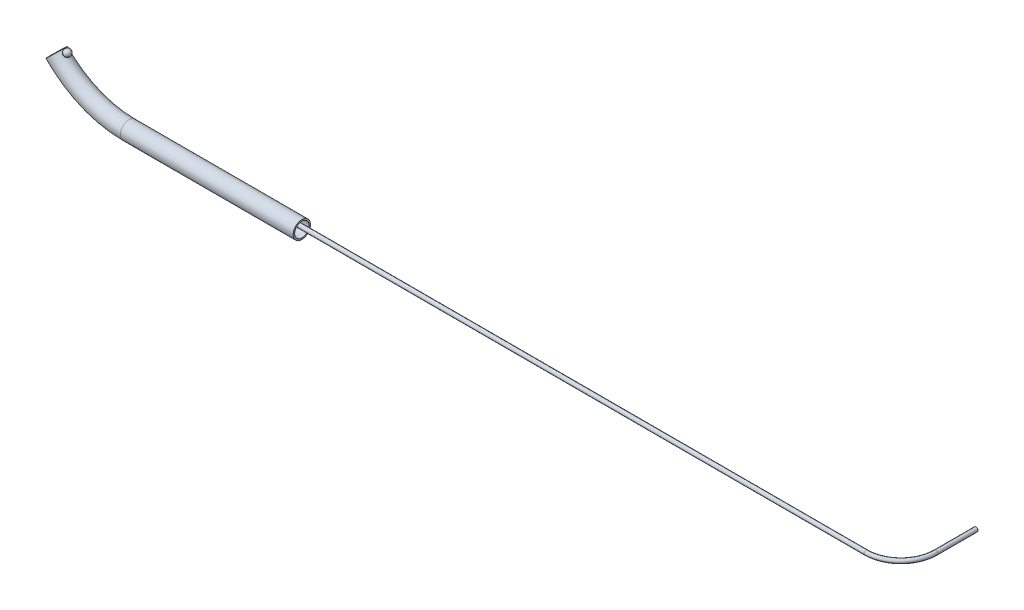
ISO-10303-21;
HEADER;
FILE_DESCRIPTION(('STEP AP214'),'2;1');
FILE_NAME('part.step','',(''),(''),'','','');
FILE_SCHEMA(('AUTOMOTIVE_DESIGN { 1 0 10303 214 1 1 1 1 }'));
ENDSEC;
DATA;
#1=APPLICATION_CONTEXT('core data for automotive mechanical design processes');
#2=APPLICATION_PROTOCOL_DEFINITION('international standard','automotive_design',2000,#1);
#3=PRODUCT_CONTEXT('',#1,'mechanical');
#4=PRODUCT('Part','Part','',(#3));
#5=PRODUCT_RELATED_PRODUCT_CATEGORY('part','',(#4));
#6=PRODUCT_DEFINITION_FORMATION('','',#4);
#7=PRODUCT_DEFINITION_CONTEXT('part definition',#1,'design');
#8=PRODUCT_DEFINITION('design','',#6,#7);
#9=PRODUCT_DEFINITION_SHAPE('','',#8);
#10=(LENGTH_UNIT() NAMED_UNIT(*) SI_UNIT(.MILLI.,.METRE.));
#11=(NAMED_UNIT(*) PLANE_ANGLE_UNIT() SI_UNIT($,.RADIAN.));
#12=(NAMED_UNIT(*) SI_UNIT($,.STERADIAN.) SOLID_ANGLE_UNIT());
#13=UNCERTAINTY_MEASURE_WITH_UNIT(LENGTH_MEASURE(1.E-05),#10,'distance_accuracy_value','');
#14=(GEOMETRIC_REPRESENTATION_CONTEXT(3) GLOBAL_UNCERTAINTY_ASSIGNED_CONTEXT((#13)) GLOBAL_UNIT_ASSIGNED_CONTEXT((#10,
#11,#12)) REPRESENTATION_CONTEXT('',''));
#15=CARTESIAN_POINT('',(0.,0.,0.));
#16=DIRECTION('',(0.,0.,1.));
#17=DIRECTION('',(1.,0.,0.));
#18=AXIS2_PLACEMENT_3D('',#15,#16,#17);
#19=CARTESIAN_POINT('',(-68.3649682129226,0.177699999999989,0.));
#20=DIRECTION('',(1.,0.,0.));
#21=DIRECTION('',(0.,1.,0.));
#22=AXIS2_PLACEMENT_3D('',#19,#20,#21);
#23=CYLINDRICAL_SURFACE('',#22,0.150000000000008);
#24=CARTESIAN_POINT('',(-68.3649682129226,0.177699999999989,0.));
#25=DIRECTION('',(-1.,0.,0.));
#26=DIRECTION('',(0.,-1.,0.));
#27=AXIS2_PLACEMENT_3D('',#24,#25,#26);
#28=CIRCLE('',#27,0.150000000000008);
#29=CARTESIAN_POINT('',(-68.3649682129226,0.0276999999999812,0.));
#30=VERTEX_POINT('',#29);
#31=EDGE_CURVE('E11',#30,#30,#28,.T.);
#32=ORIENTED_EDGE('',*,*,#31,.F.);
#33=EDGE_LOOP('',(#32));
#34=FACE_BOUND('',#33,.T.);
#35=CARTESIAN_POINT('',(-15.4542229508361,0.177700000000038,0.));
#36=DIRECTION('',(1.,0.,0.));
#37=DIRECTION('',(0.,1.,0.));
#38=AXIS2_PLACEMENT_3D('',#35,#36,#37);
#39=CIRCLE('',#38,0.150000000000008);
#40=CARTESIAN_POINT('',(-15.4542229508361,0.177700000000038,0.150000000000008));
#41=VERTEX_POINT('',#40);
#42=EDGE_CURVE('E58',#41,#41,#39,.T.);
#43=ORIENTED_EDGE('',*,*,#42,.F.);
#44=EDGE_LOOP('',(#43));
#45=FACE_BOUND('',#44,.T.);
#46=ADVANCED_FACE('F39',(#34,#45),#23,.T.);
#47=CARTESIAN_POINT('',(-68.3649682129226,7.15322745789866,0.));
#48=DIRECTION('',(0.,0.,-1.));
#49=DIRECTION('',(-1.,0.,0.));
#50=AXIS2_PLACEMENT_3D('',#47,#48,#49);
#51=TOROIDAL_SURFACE('',#50,6.97552745789867,0.150000000000008);
#52=CARTESIAN_POINT('',(-73.4211282675444,2.34768598810101,0.));
#53=DIRECTION('',(-0.688914422429251,0.724842685393853,0.));
#54=DIRECTION('',(-0.724842685393853,-0.688914422429251,0.));
#55=AXIS2_PLACEMENT_3D('',#52,#53,#54);
#56=CIRCLE('',#55,0.150000000000008);
#57=CARTESIAN_POINT('',(-73.5298546703535,2.24434882473662,0.));
#58=VERTEX_POINT('',#57);
#59=EDGE_CURVE('E45',#58,#58,#56,.T.);
#60=CARTESIAN_POINT('',(-68.3649682129226,7.15322745789866,0.));
#61=DIRECTION('',(0.,0.,-1.));
#62=DIRECTION('',(-1.,0.,0.));
#63=AXIS2_PLACEMENT_3D('',#60,#61,#62);
#64=CIRCLE('',#63,7.12552745789868);
#65=EDGE_CURVE('',#30,#58,#64,.T.);
#66=ORIENTED_EDGE('',*,*,#31,.T.);
#67=ORIENTED_EDGE('',*,*,#59,.F.);
#68=ORIENTED_EDGE('',*,*,#65,.T.);
#69=ORIENTED_EDGE('',*,*,#65,.F.);
#70=EDGE_LOOP('',(#66,#68,#67,#69));
#71=FACE_BOUND('',#70,.T.);
#72=ADVANCED_FACE('F66',(#71),#51,.T.);
#73=CARTESIAN_POINT('',(-73.4211282675444,2.34768598810101,0.));
#74=DIRECTION('',(-0.688914422429251,0.724842685393853,0.));
#75=DIRECTION('',(-0.724842685393853,-0.688914422429251,0.));
#76=AXIS2_PLACEMENT_3D('',#73,#74,#75);
#77=PLANE('',#76);
#78=ORIENTED_EDGE('',*,*,#59,.T.);
#79=EDGE_LOOP('',(#78));
#80=FACE_BOUND('',#79,.T.);
#81=ADVANCED_FACE('F71',(#80),#77,.T.);
#82=CARTESIAN_POINT('',(-12.9542229508361,0.177700000000041,-2.50000000000001));
#83=DIRECTION('',(0.,0.,-1.));
#84=DIRECTION('',(-1.,0.,0.));
#85=AXIS2_PLACEMENT_3D('',#82,#83,#84);
#86=CYLINDRICAL_SURFACE('',#85,0.150000000000008);
#87=CARTESIAN_POINT('',(-12.9542229508361,0.177700000000041,-2.50000000000001));
#88=DIRECTION('',(0.,0.,-1.));
#89=DIRECTION('',(0.,1.,0.));
#90=AXIS2_PLACEMENT_3D('',#87,#88,#89);
#91=CIRCLE('',#90,0.150000000000008);
#92=CARTESIAN_POINT('',(-12.8042229508361,0.177700000000041,-2.50000000000001));
#93=VERTEX_POINT('',#92);
#94=EDGE_CURVE('E53',#93,#93,#91,.T.);
#95=ORIENTED_EDGE('',*,*,#94,.T.);
#96=EDGE_LOOP('',(#95));
#97=FACE_BOUND('',#96,.T.);
#98=CARTESIAN_POINT('',(-12.9542229508361,0.177700000000041,-5.38145147143735));
#99=DIRECTION('',(0.,0.,-1.));
#100=DIRECTION('',(0.,1.,0.));
#101=AXIS2_PLACEMENT_3D('',#98,#99,#100);
#102=CIRCLE('',#101,0.150000000000008);
#103=CARTESIAN_POINT('',(-12.9542229508361,0.327700000000049,-5.38145147143735));
#104=VERTEX_POINT('',#103);
#105=EDGE_CURVE('E49',#104,#104,#102,.T.);
#106=ORIENTED_EDGE('',*,*,#105,.F.);
#107=EDGE_LOOP('',(#106));
#108=FACE_BOUND('',#107,.T.);
#109=ADVANCED_FACE('F75',(#97,#108),#86,.T.);
#110=CARTESIAN_POINT('',(-15.4542229508361,0.177700000000038,-2.5));
#111=DIRECTION('',(0.,1.,0.));
#112=DIRECTION('',(-1.,0.,0.));
#113=AXIS2_PLACEMENT_3D('',#110,#111,#112);
#114=TOROIDAL_SURFACE('',#113,2.5,0.150000000000008);
#115=CARTESIAN_POINT('',(-15.4542229508361,0.177700000000038,-2.5));
#116=DIRECTION('',(0.,1.,0.));
#117=DIRECTION('',(-1.,0.,0.));
#118=AXIS2_PLACEMENT_3D('',#115,#116,#117);
#119=CIRCLE('',#118,2.65000000000001);
#120=EDGE_CURVE('',#41,#93,#119,.T.);
#121=ORIENTED_EDGE('',*,*,#42,.T.);
#122=ORIENTED_EDGE('',*,*,#94,.F.);
#123=ORIENTED_EDGE('',*,*,#120,.T.);
#124=ORIENTED_EDGE('',*,*,#120,.F.);
#125=EDGE_LOOP('',(#121,#123,#122,#124));
#126=FACE_BOUND('',#125,.T.);
#127=ADVANCED_FACE('F62',(#126),#114,.T.);
#128=CARTESIAN_POINT('',(-12.9542229508361,0.177700000000041,-5.38145147143735));
#129=DIRECTION('',(0.,0.,-1.));
#130=DIRECTION('',(0.,1.,0.));
#131=AXIS2_PLACEMENT_3D('',#128,#129,#130);
#132=PLANE('',#131);
#133=ORIENTED_EDGE('',*,*,#105,.T.);
#134=EDGE_LOOP('',(#133));
#135=FACE_BOUND('',#134,.T.);
#136=ADVANCED_FACE('F84',(#135),#132,.T.);
#137=CLOSED_SHELL('',(#46,#72,#81,#109,#127,#136));
#138=MANIFOLD_SOLID_BREP('B2',#137);
#139=CARTESIAN_POINT('',(-68.3649682129226,7.15322745789866,0.));
#140=DIRECTION('',(0.,0.,-1.));
#141=DIRECTION('',(-1.,0.,0.));
#142=AXIS2_PLACEMENT_3D('',#139,#140,#141);
#143=TOROIDAL_SURFACE('',#142,7.15322745789866,0.6223);
#144=CARTESIAN_POINT('',(-72.9296125399738,2.45231556693282,-0.162231624588265));
#145=CARTESIAN_POINT('',(-72.9215501748899,2.44420333768813,-0.162985915621017));
#146=CARTESIAN_POINT('',(-72.9132495705184,2.43623847207314,-0.162846709843409));
#147=CARTESIAN_POINT('',(-72.8963949861295,2.42081537807001,-0.160778709201735));
#148=CARTESIAN_POINT('',(-72.8878408277221,2.41335751915316,-0.158848623959505));
#149=CARTESIAN_POINT('',(-72.8707373660263,2.39911414014025,-0.153191778621824));
#150=CARTESIAN_POINT('',(-72.8621880917451,2.39232970055476,-0.149462185634209));
#151=CARTESIAN_POINT('',(-72.8454360430442,2.37959646254954,-0.140212048773996));
#152=CARTESIAN_POINT('',(-72.8372332315845,2.37364757464263,-0.134691696900749));
#153=CARTESIAN_POINT('',(-72.8218060884418,2.36288393777016,-0.122093918042157));
#154=CARTESIAN_POINT('',(-72.8145597209712,2.35804041634906,-0.115068420488231));
#155=CARTESIAN_POINT('',(-72.8011924504897,2.34938409272325,-0.0994744633301903));
#156=CARTESIAN_POINT('',(-72.7950704932524,2.34557032344803,-0.0909074640869792));
#157=CARTESIAN_POINT('',(-72.7850736501799,2.33948792826428,-0.0736061865020022));
#158=CARTESIAN_POINT('',(-72.781013716827,2.33708589881384,-0.0650260965331795));
#159=CARTESIAN_POINT('',(-72.7743973684886,2.33322303008166,-0.0471086922633796));
#160=CARTESIAN_POINT('',(-72.7718391225746,2.33176104444553,-0.0377723159424036));
#161=CARTESIAN_POINT('',(-72.7686653842543,2.32995580921218,-0.0199973692769874));
#162=CARTESIAN_POINT('',(-72.7678327334275,2.32948730131519,-0.011609727470488));
#163=CARTESIAN_POINT('',(-72.7674973160465,2.32929803884335,0.00519934363481592));
#164=CARTESIAN_POINT('',(-72.7679940046332,2.32957697791094,0.0136207576785419));
#165=CARTESIAN_POINT('',(-72.7702102738688,2.33083351394292,0.0297025399185543));
#166=CARTESIAN_POINT('',(-72.7718512653795,2.33176623062762,0.0373775275720592));
#167=CARTESIAN_POINT('',(-72.7761766208485,2.3342596299772,0.0523186782891281));
#168=CARTESIAN_POINT('',(-72.7788610594966,2.33582035759531,0.0595848120443553));
#169=CARTESIAN_POINT('',(-72.7852512080412,2.33960631113679,0.0738019379896634));
#170=CARTESIAN_POINT('',(-72.7889905542734,2.34185366946152,0.0807318124321275));
#171=CARTESIAN_POINT('',(-72.7972669139487,2.34694798104276,0.0938534271152317));
#172=CARTESIAN_POINT('',(-72.8018042151244,2.34979515065723,0.100044899741415));
#173=CARTESIAN_POINT('',(-72.8120123433624,2.35637787321964,0.112221774400418));
#174=CARTESIAN_POINT('',(-72.8177523902374,2.36017568266087,0.118115344466518));
#175=CARTESIAN_POINT('',(-72.8297598410948,2.36839028741973,0.128835206562353));
#176=CARTESIAN_POINT('',(-72.8360274999649,2.37280738260601,0.133660978610083));
#177=CARTESIAN_POINT('',(-72.8497219337649,2.38280836253562,0.142770664884137));
#178=CARTESIAN_POINT('',(-72.8571935263533,2.38846927876268,0.146902796180538));
#179=CARTESIAN_POINT('',(-72.8722952549711,2.40040312787,0.153749912437162));
#180=CARTESIAN_POINT('',(-72.8799254653304,2.40667635301531,0.15646421668056));
#181=CARTESIAN_POINT('',(-72.8959291893155,2.42041080660626,0.160682718197196));
#182=CARTESIAN_POINT('',(-72.904296668265,2.42792761933674,0.162030015164965));
#183=CARTESIAN_POINT('',(-72.9207220427379,2.44340003977206,0.162990307676196));
#184=CARTESIAN_POINT('',(-72.9287798287983,2.45135580024961,0.162602695587667));
#185=CARTESIAN_POINT('',(-72.9447498127938,2.46787340554959,0.160032545070037));
#186=CARTESIAN_POINT('',(-72.952637563331,2.47644619234303,0.157766881614251));
#187=CARTESIAN_POINT('',(-72.9676574964394,2.49354628269152,0.151331048323228));
#188=CARTESIAN_POINT('',(-72.9747895849688,2.50207358046036,0.147160641785323));
#189=CARTESIAN_POINT('',(-72.9879595528189,2.51850933164872,0.137056287312086));
#190=CARTESIAN_POINT('',(-72.9940202797939,2.5264279135323,0.131168900787446));
#191=CARTESIAN_POINT('',(-73.0051104088774,2.54146259807317,0.117646424643872));
#192=CARTESIAN_POINT('',(-73.0101404599229,2.54857920439425,0.110012441171333));
#193=CARTESIAN_POINT('',(-73.0185749559031,2.56087620567489,0.0939956681869445));
#194=CARTESIAN_POINT('',(-73.0220926435068,2.56617986143605,0.0857677752173634));
#195=CARTESIAN_POINT('',(-73.0280775781637,2.57538568676014,0.0682183020941197));
#196=CARTESIAN_POINT('',(-73.0305462382761,2.57928974049664,0.0588982148881641));
#197=CARTESIAN_POINT('',(-73.0340767537525,2.58493685065564,0.0408849101830477));
#198=CARTESIAN_POINT('',(-73.0352893555977,2.58690917771996,0.0322927969828676));
#199=CARTESIAN_POINT('',(-73.03684537088,2.58944738088496,0.0148277251516942));
#200=CARTESIAN_POINT('',(-73.0371894040806,2.5900142598322,0.00595497135065177));
#201=CARTESIAN_POINT('',(-73.0370079156127,2.58971678700277,-0.0108743191841573));
#202=CARTESIAN_POINT('',(-73.0365650701557,2.58898850879263,-0.0188346392271665));
#203=CARTESIAN_POINT('',(-73.0349783886321,2.586404234979,-0.0344965034716511));
#204=CARTESIAN_POINT('',(-73.0338346091183,2.58454833035469,-0.0421980684971065));
#205=CARTESIAN_POINT('',(-73.030875745764,2.5798180665763,-0.057134396606846));
#206=CARTESIAN_POINT('',(-73.0290612748371,2.57694463739067,-0.0643695788290028));
#207=CARTESIAN_POINT('',(-73.024800243945,2.57032654058017,-0.0782271610208334));
#208=CARTESIAN_POINT('',(-73.0223535271467,2.56658165680752,-0.0848494083931327));
#209=CARTESIAN_POINT('',(-73.0166424786211,2.55804123795011,-0.0978968045459019));
#210=CARTESIAN_POINT('',(-73.0133267953118,2.55318393847707,-0.10425887638866));
#211=CARTESIAN_POINT('',(-73.0060644690918,2.54284792182489,-0.116048600807803));
#212=CARTESIAN_POINT('',(-73.0021174795615,2.5373688637512,-0.121475736636416));
#213=CARTESIAN_POINT('',(-72.9931158802613,2.52526180564205,-0.13197261554992));
#214=CARTESIAN_POINT('',(-72.9879842877483,2.51857620694077,-0.136909828851794));
#215=CARTESIAN_POINT('',(-72.9770866273557,2.50491070439849,-0.145502938981017));
#216=CARTESIAN_POINT('',(-72.9713205301259,2.49793078695248,-0.149158776503325));
#217=CARTESIAN_POINT('',(-72.9597410586429,2.48445892215581,-0.154934806732401));
#218=CARTESIAN_POINT('',(-72.9539698605184,2.4779735828661,-0.157155893578039));
#219=CARTESIAN_POINT('',(-72.942051704856,2.46506742440212,-0.160510070361542));
#220=CARTESIAN_POINT('',(-72.9359046752808,2.4586466178735,-0.161642951017979));
#221=CARTESIAN_POINT('',(-72.9296125399738,2.45231556693282,-0.162231624588265));
#222=B_SPLINE_CURVE_WITH_KNOTS('',3,(#144,#145,#146,#147,#148,#149,#150,#151,#152,#153,#154,
#155,#156,#157,#158,#159,#160,#161,#162,#163,#164,#165,#166,#167,#168,#169,#170,#171,#172,#173,
#174,#175,#176,#177,#178,#179,#180,#181,#182,#183,#184,#185,#186,#187,#188,#189,#190,#191,#192,
#193,#194,#195,#196,#197,#198,#199,#200,#201,#202,#203,#204,#205,#206,#207,#208,#209,#210,#211,
#212,#213,#214,#215,#216,#217,#218,#219,#220,#221),.UNSPECIFIED.,.T.,.F.,(4,2,2,2,2,2,2,2,2,2,2,
2,2,2,2,2,2,2,2,2,2,2,2,2,2,2,2,2,2,2,2,2,2,2,2,2,2,2,4),(0.,0.0343562064778077,
0.0687371867909832,0.103172469163847,0.13760406071719,0.170998168480232,0.204360804906564,
0.23356151259637,0.262726543049339,0.287919015904831,0.313101164651425,0.336705153351786,
0.360310831933616,0.384776295661251,0.409250599483896,0.436325958133949,0.46341447270434,
0.494021264414464,0.524642737359924,0.558477983235079,0.592325080443995,0.62775567208611,
0.6631906678909,0.697742190245707,0.732271890872163,0.763293139778437,0.794272469004267,
0.820819320597968,0.847347224433725,0.871250118652053,0.895151084592733,0.919030262342344,
0.942915369193818,0.968803066440357,0.99470502646684,1.02389066160519,1.05307764734407,
1.07988520812325,1.10669792344214),.UNSPECIFIED.);
#223=CARTESIAN_POINT('',(-72.9296125399738,2.45231556693282,-0.162231624588265));
#224=VERTEX_POINT('',#223);
#225=EDGE_CURVE('E134',#224,#224,#222,.T.);
#226=ORIENTED_EDGE('',*,*,#225,.T.);
#227=EDGE_LOOP('',(#226));
#228=FACE_BOUND('',#227,.T.);
#229=CARTESIAN_POINT('',(-68.3649682129226,0.,0.));
#230=DIRECTION('',(1.,0.,0.));
#231=DIRECTION('',(0.,0.,-1.));
#232=AXIS2_PLACEMENT_3D('',#229,#230,#231);
#233=CIRCLE('',#232,0.6223);
#234=CARTESIAN_POINT('',(-68.3649682129226,0.,-0.6223));
#235=VERTEX_POINT('',#234);
#236=EDGE_CURVE('E145',#235,#235,#233,.T.);
#237=ORIENTED_EDGE('',*,*,#236,.F.);
#238=EDGE_LOOP('',(#237));
#239=FACE_BOUND('',#238,.T.);
#240=CARTESIAN_POINT('',(-73.5499328127389,2.22526589523535,0.));
#241=DIRECTION('',(0.688914422429251,-0.724842685393853,0.));
#242=DIRECTION('',(0.,0.,-1.));
#243=AXIS2_PLACEMENT_3D('',#240,#241,#242);
#244=CIRCLE('',#243,0.6223);
#245=CARTESIAN_POINT('',(-73.5499328127389,2.22526589523535,-0.6223));
#246=VERTEX_POINT('',#245);
#247=EDGE_CURVE('E38',#246,#246,#244,.T.);
#248=ORIENTED_EDGE('',*,*,#247,.T.);
#249=EDGE_LOOP('',(#248));
#250=FACE_BOUND('',#249,.T.);
#251=ADVANCED_FACE('F130',(#228,#239,#250),#143,.T.);
#252=CARTESIAN_POINT('',(-68.3649682129226,7.15322745789866,0.));
#253=DIRECTION('',(0.,0.,-1.));
#254=DIRECTION('',(-1.,0.,0.));
#255=AXIS2_PLACEMENT_3D('',#252,#253,#254);
#256=TOROIDAL_SURFACE('',#255,7.15322745789866,0.51435);
#257=CARTESIAN_POINT('',(-68.3649682129226,0.,0.));
#258=DIRECTION('',(1.,0.,0.));
#259=DIRECTION('',(0.,0.,-1.));
#260=AXIS2_PLACEMENT_3D('',#257,#258,#259);
#261=CIRCLE('',#260,0.51435);
#262=CARTESIAN_POINT('',(-68.3649682129226,-0.51435,0.));
#263=VERTEX_POINT('',#262);
#264=EDGE_CURVE('E150',#263,#263,#261,.T.);
#265=CARTESIAN_POINT('',(-73.5499328127389,2.22526589523535,0.));
#266=DIRECTION('',(0.688914422429251,-0.724842685393853,0.));
#267=DIRECTION('',(0.,0.,-1.));
#268=AXIS2_PLACEMENT_3D('',#265,#266,#267);
#269=CIRCLE('',#268,0.51435);
#270=CARTESIAN_POINT('',(-73.9227556479712,1.87092276205886,0.));
#271=VERTEX_POINT('',#270);
#272=EDGE_CURVE('E141',#271,#271,#269,.T.);
#273=CARTESIAN_POINT('',(-68.3649682129226,7.15322745789866,0.));
#274=DIRECTION('',(0.,0.,-1.));
#275=DIRECTION('',(-1.,0.,0.));
#276=AXIS2_PLACEMENT_3D('',#273,#274,#275);
#277=CIRCLE('',#276,7.66757745789866);
#278=EDGE_CURVE('',#263,#271,#277,.T.);
#279=ORIENTED_EDGE('',*,*,#264,.T.);
#280=ORIENTED_EDGE('',*,*,#272,.F.);
#281=ORIENTED_EDGE('',*,*,#278,.T.);
#282=ORIENTED_EDGE('',*,*,#278,.F.);
#283=EDGE_LOOP('',(#279,#281,#280,#282));
#284=FACE_BOUND('',#283,.T.);
#285=ADVANCED_FACE('F176',(#284),#256,.F.);
#286=CARTESIAN_POINT('',(-68.3649682129226,0.,0.));
#287=DIRECTION('',(1.,0.,0.));
#288=DIRECTION('',(0.,0.,-1.));
#289=AXIS2_PLACEMENT_3D('',#286,#287,#288);
#290=CYLINDRICAL_SURFACE('',#289,0.51435);
#291=ORIENTED_EDGE('',*,*,#264,.F.);
#292=EDGE_LOOP('',(#291));
#293=FACE_BOUND('',#292,.T.);
#294=CARTESIAN_POINT('',(-55.9542229508361,0.,0.));
#295=DIRECTION('',(1.,0.,0.));
#296=DIRECTION('',(0.,0.,-1.));
#297=AXIS2_PLACEMENT_3D('',#294,#295,#296);
#298=CIRCLE('',#297,0.51435);
#299=CARTESIAN_POINT('',(-55.9542229508361,0.,-0.51435));
#300=VERTEX_POINT('',#299);
#301=EDGE_CURVE('E156',#300,#300,#298,.T.);
#302=ORIENTED_EDGE('',*,*,#301,.T.);
#303=EDGE_LOOP('',(#302));
#304=FACE_BOUND('',#303,.T.);
#305=ADVANCED_FACE('F180',(#293,#304),#290,.F.);
#306=CARTESIAN_POINT('',(-68.3649682129226,0.,0.));
#307=DIRECTION('',(1.,0.,0.));
#308=DIRECTION('',(0.,0.,-1.));
#309=AXIS2_PLACEMENT_3D('',#306,#307,#308);
#310=CYLINDRICAL_SURFACE('',#309,0.6223);
#311=ORIENTED_EDGE('',*,*,#236,.T.);
#312=EDGE_LOOP('',(#311));
#313=FACE_BOUND('',#312,.T.);
#314=CARTESIAN_POINT('',(-55.9542229508361,0.,0.));
#315=DIRECTION('',(1.,0.,0.));
#316=DIRECTION('',(0.,0.,-1.));
#317=AXIS2_PLACEMENT_3D('',#314,#315,#316);
#318=CIRCLE('',#317,0.6223);
#319=CARTESIAN_POINT('',(-55.9542229508361,0.,-0.6223));
#320=VERTEX_POINT('',#319);
#321=EDGE_CURVE('E153',#320,#320,#318,.T.);
#322=ORIENTED_EDGE('',*,*,#321,.F.);
#323=EDGE_LOOP('',(#322));
#324=FACE_BOUND('',#323,.T.);
#325=ADVANCED_FACE('F185',(#313,#324),#310,.T.);
#326=CARTESIAN_POINT('',(-73.5499328127389,2.22526589523535,0.));
#327=DIRECTION('',(0.688914422429251,-0.724842685393853,0.));
#328=DIRECTION('',(0.,0.,-1.));
#329=AXIS2_PLACEMENT_3D('',#326,#327,#328);
#330=PLANE('',#329);
#331=ORIENTED_EDGE('',*,*,#272,.T.);
#332=EDGE_LOOP('',(#331));
#333=FACE_BOUND('',#332,.T.);
#334=ORIENTED_EDGE('',*,*,#247,.F.);
#335=EDGE_LOOP('',(#334));
#336=FACE_BOUND('',#335,.T.);
#337=ADVANCED_FACE('F171',(#333,#336),#330,.F.);
#338=CARTESIAN_POINT('',(-55.9542229508361,0.,0.));
#339=DIRECTION('',(1.,0.,0.));
#340=DIRECTION('',(0.,0.,-1.));
#341=AXIS2_PLACEMENT_3D('',#338,#339,#340);
#342=PLANE('',#341);
#343=ORIENTED_EDGE('',*,*,#321,.T.);
#344=EDGE_LOOP('',(#343));
#345=FACE_BOUND('',#344,.T.);
#346=ORIENTED_EDGE('',*,*,#301,.F.);
#347=EDGE_LOOP('',(#346));
#348=FACE_BOUND('',#347,.T.);
#349=ADVANCED_FACE('F167',(#345,#348),#342,.T.);
#350=CARTESIAN_POINT('',(-72.7873645897432,2.57859470474387,0.));
#351=DIRECTION('',(-0.646795710542048,-0.762663299775469,0.));
#352=DIRECTION('',(0.762663299775469,-0.646795710542048,0.));
#353=AXIS2_PLACEMENT_3D('',#350,#351,#352);
#354=SPHERICAL_SURFACE('',#353,0.25);
#355=ORIENTED_EDGE('',*,*,#225,.F.);
#356=EDGE_LOOP('',(#355));
#357=FACE_BOUND('',#356,.T.);
#358=ADVANCED_FACE('F165',(#357),#354,.T.);
#359=CLOSED_SHELL('',(#251,#285,#305,#325,#337,#349,#358));
#360=MANIFOLD_SOLID_BREP('B6',#359);
#361=ADVANCED_BREP_SHAPE_REPRESENTATION('',(#18,#138,#360),#14);
#362=SHAPE_DEFINITION_REPRESENTATION(#9,#361);
ENDSEC;
END-ISO-10303-21;
